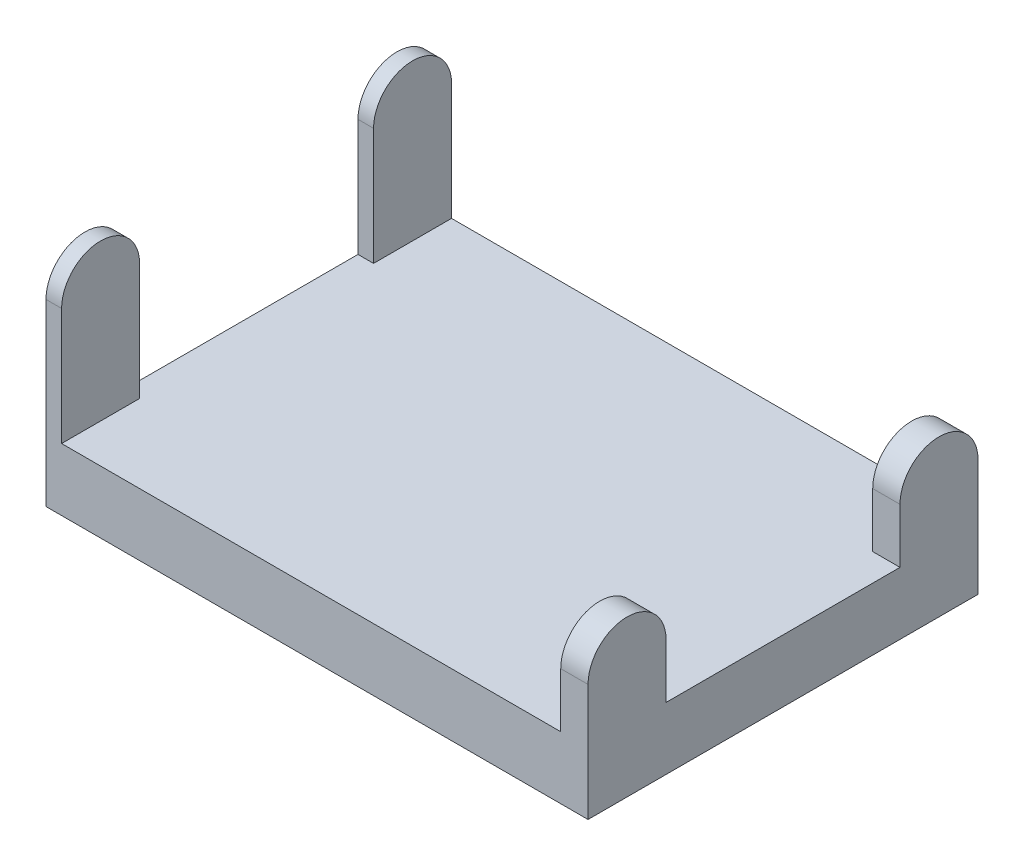
ISO-10303-21;
HEADER;
FILE_DESCRIPTION(('STEP AP214'),'2;1');
FILE_NAME('part.step','',(''),(''),'','','');
FILE_SCHEMA(('AUTOMOTIVE_DESIGN { 1 0 10303 214 1 1 1 1 }'));
ENDSEC;
DATA;
#1=APPLICATION_CONTEXT('core data for automotive mechanical design processes');
#2=APPLICATION_PROTOCOL_DEFINITION('international standard','automotive_design',2000,#1);
#3=PRODUCT_CONTEXT('',#1,'mechanical');
#4=PRODUCT('Part','Part','',(#3));
#5=PRODUCT_RELATED_PRODUCT_CATEGORY('part','',(#4));
#6=PRODUCT_DEFINITION_FORMATION('','',#4);
#7=PRODUCT_DEFINITION_CONTEXT('part definition',#1,'design');
#8=PRODUCT_DEFINITION('design','',#6,#7);
#9=PRODUCT_DEFINITION_SHAPE('','',#8);
#10=(LENGTH_UNIT() NAMED_UNIT(*) SI_UNIT(.MILLI.,.METRE.));
#11=(NAMED_UNIT(*) PLANE_ANGLE_UNIT() SI_UNIT($,.RADIAN.));
#12=(NAMED_UNIT(*) SI_UNIT($,.STERADIAN.) SOLID_ANGLE_UNIT());
#13=UNCERTAINTY_MEASURE_WITH_UNIT(LENGTH_MEASURE(1.E-05),#10,'distance_accuracy_value','');
#14=(GEOMETRIC_REPRESENTATION_CONTEXT(3) GLOBAL_UNCERTAINTY_ASSIGNED_CONTEXT((#13)) GLOBAL_UNIT_ASSIGNED_CONTEXT((#10,
#11,#12)) REPRESENTATION_CONTEXT('',''));
#15=CARTESIAN_POINT('',(0.,0.,0.));
#16=DIRECTION('',(0.,0.,1.));
#17=DIRECTION('',(1.,0.,0.));
#18=AXIS2_PLACEMENT_3D('',#15,#16,#17);
#19=CARTESIAN_POINT('',(17.375,7.5,10.));
#20=DIRECTION('',(1.,0.,0.));
#21=DIRECTION('',(0.,0.,-1.));
#22=AXIS2_PLACEMENT_3D('',#19,#20,#21);
#23=CYLINDRICAL_SURFACE('',#22,2.5);
#24=DIRECTION('',(-1.,0.,0.));
#25=VECTOR('',#24,1.);
#26=CARTESIAN_POINT('',(17.375,7.5,12.5));
#27=LINE('',#26,#25);
#28=CARTESIAN_POINT('',(17.375,7.5,12.5));
#29=VERTEX_POINT('',#28);
#30=CARTESIAN_POINT('',(15.625,7.5,12.5));
#31=VERTEX_POINT('',#30);
#32=EDGE_CURVE('E274',#29,#31,#27,.T.);
#33=ORIENTED_EDGE('',*,*,#32,.F.);
#34=CARTESIAN_POINT('',(17.375,7.5,10.));
#35=DIRECTION('',(-1.,0.,0.));
#36=DIRECTION('',(0.,0.,1.));
#37=AXIS2_PLACEMENT_3D('',#34,#35,#36);
#38=CIRCLE('',#37,2.5);
#39=CARTESIAN_POINT('',(17.375,7.5,7.5));
#40=VERTEX_POINT('',#39);
#41=EDGE_CURVE('E49',#40,#29,#38,.F.);
#42=ORIENTED_EDGE('',*,*,#41,.F.);
#43=DIRECTION('',(-1.,0.,0.));
#44=VECTOR('',#43,1.);
#45=CARTESIAN_POINT('',(17.375,7.5,7.5));
#46=LINE('',#45,#44);
#47=CARTESIAN_POINT('',(15.625,7.5,7.5));
#48=VERTEX_POINT('',#47);
#49=EDGE_CURVE('E276',#48,#40,#46,.F.);
#50=ORIENTED_EDGE('',*,*,#49,.F.);
#51=CARTESIAN_POINT('',(15.625,7.5,10.));
#52=DIRECTION('',(1.,0.,0.));
#53=DIRECTION('',(0.,0.,-1.));
#54=AXIS2_PLACEMENT_3D('',#51,#52,#53);
#55=CIRCLE('',#54,2.5);
#56=EDGE_CURVE('E11',#31,#48,#55,.F.);
#57=ORIENTED_EDGE('',*,*,#56,.F.);
#58=EDGE_LOOP('',(#33,#42,#50,#57));
#59=FACE_BOUND('',#58,.T.);
#60=ADVANCED_FACE('F41',(#59),#23,.T.);
#61=CARTESIAN_POINT('',(17.375,7.5,-10.));
#62=DIRECTION('',(1.,0.,0.));
#63=DIRECTION('',(0.,0.,-1.));
#64=AXIS2_PLACEMENT_3D('',#61,#62,#63);
#65=CYLINDRICAL_SURFACE('',#64,2.5);
#66=DIRECTION('',(-1.,0.,0.));
#67=VECTOR('',#66,1.);
#68=CARTESIAN_POINT('',(17.375,7.5,-7.5));
#69=LINE('',#68,#67);
#70=CARTESIAN_POINT('',(17.375,7.5,-7.5));
#71=VERTEX_POINT('',#70);
#72=CARTESIAN_POINT('',(15.625,7.5,-7.5));
#73=VERTEX_POINT('',#72);
#74=EDGE_CURVE('E264',#71,#73,#69,.T.);
#75=ORIENTED_EDGE('',*,*,#74,.F.);
#76=CARTESIAN_POINT('',(17.375,7.5,-10.));
#77=DIRECTION('',(-1.,0.,0.));
#78=DIRECTION('',(0.,0.,1.));
#79=AXIS2_PLACEMENT_3D('',#76,#77,#78);
#80=CIRCLE('',#79,2.5);
#81=CARTESIAN_POINT('',(17.375,7.5,-12.5));
#82=VERTEX_POINT('',#81);
#83=EDGE_CURVE('E270',#82,#71,#80,.F.);
#84=ORIENTED_EDGE('',*,*,#83,.F.);
#85=DIRECTION('',(-1.,0.,0.));
#86=VECTOR('',#85,1.);
#87=CARTESIAN_POINT('',(17.375,7.5,-12.5));
#88=LINE('',#87,#86);
#89=CARTESIAN_POINT('',(15.625,7.5,-12.5));
#90=VERTEX_POINT('',#89);
#91=EDGE_CURVE('E267',#90,#82,#88,.F.);
#92=ORIENTED_EDGE('',*,*,#91,.F.);
#93=CARTESIAN_POINT('',(15.625,7.5,-10.));
#94=DIRECTION('',(1.,0.,0.));
#95=DIRECTION('',(0.,0.,-1.));
#96=AXIS2_PLACEMENT_3D('',#93,#94,#95);
#97=CIRCLE('',#96,2.5);
#98=EDGE_CURVE('E272',#73,#90,#97,.F.);
#99=ORIENTED_EDGE('',*,*,#98,.F.);
#100=EDGE_LOOP('',(#75,#84,#92,#99));
#101=FACE_BOUND('',#100,.T.);
#102=ADVANCED_FACE('F297',(#101),#65,.T.);
#103=CARTESIAN_POINT('',(-17.375,11.5,10.));
#104=DIRECTION('',(-1.,0.,0.));
#105=DIRECTION('',(0.,0.,1.));
#106=AXIS2_PLACEMENT_3D('',#103,#104,#105);
#107=CYLINDRICAL_SURFACE('',#106,2.5);
#108=DIRECTION('',(-1.,0.,0.));
#109=VECTOR('',#108,1.);
#110=CARTESIAN_POINT('',(-17.375,11.5,7.5));
#111=LINE('',#110,#109);
#112=CARTESIAN_POINT('',(-17.375,11.5,7.5));
#113=VERTEX_POINT('',#112);
#114=CARTESIAN_POINT('',(-16.375,11.5,7.5));
#115=VERTEX_POINT('',#114);
#116=EDGE_CURVE('E256',#113,#115,#111,.F.);
#117=ORIENTED_EDGE('',*,*,#116,.F.);
#118=CARTESIAN_POINT('',(-17.375,11.5,10.));
#119=DIRECTION('',(1.,0.,0.));
#120=DIRECTION('',(0.,0.,-1.));
#121=AXIS2_PLACEMENT_3D('',#118,#119,#120);
#122=CIRCLE('',#121,2.5);
#123=CARTESIAN_POINT('',(-17.375,11.5,12.5));
#124=VERTEX_POINT('',#123);
#125=EDGE_CURVE('E261',#124,#113,#122,.F.);
#126=ORIENTED_EDGE('',*,*,#125,.F.);
#127=DIRECTION('',(-1.,0.,0.));
#128=VECTOR('',#127,1.);
#129=CARTESIAN_POINT('',(-17.375,11.5,12.5));
#130=LINE('',#129,#128);
#131=CARTESIAN_POINT('',(-16.375,11.5,12.5));
#132=VERTEX_POINT('',#131);
#133=EDGE_CURVE('E259',#132,#124,#130,.T.);
#134=ORIENTED_EDGE('',*,*,#133,.F.);
#135=CARTESIAN_POINT('',(-16.375,11.5,10.));
#136=DIRECTION('',(-1.,0.,0.));
#137=DIRECTION('',(0.,0.,1.));
#138=AXIS2_PLACEMENT_3D('',#135,#136,#137);
#139=CIRCLE('',#138,2.5);
#140=EDGE_CURVE('E157',#115,#132,#139,.F.);
#141=ORIENTED_EDGE('',*,*,#140,.F.);
#142=EDGE_LOOP('',(#117,#126,#134,#141));
#143=FACE_BOUND('',#142,.T.);
#144=ADVANCED_FACE('F322',(#143),#107,.T.);
#145=CARTESIAN_POINT('',(-17.375,11.5,-10.));
#146=DIRECTION('',(-1.,0.,0.));
#147=DIRECTION('',(0.,0.,1.));
#148=AXIS2_PLACEMENT_3D('',#145,#146,#147);
#149=CYLINDRICAL_SURFACE('',#148,2.5);
#150=DIRECTION('',(1.,0.,0.));
#151=VECTOR('',#150,1.);
#152=CARTESIAN_POINT('',(-17.375,11.5,-12.5));
#153=LINE('',#152,#151);
#154=CARTESIAN_POINT('',(-17.375,11.5,-12.5));
#155=VERTEX_POINT('',#154);
#156=CARTESIAN_POINT('',(-16.375,11.5,-12.5));
#157=VERTEX_POINT('',#156);
#158=EDGE_CURVE('E246',#155,#157,#153,.T.);
#159=ORIENTED_EDGE('',*,*,#158,.F.);
#160=CARTESIAN_POINT('',(-17.375,11.5,-10.));
#161=DIRECTION('',(1.,0.,0.));
#162=DIRECTION('',(0.,0.,-1.));
#163=AXIS2_PLACEMENT_3D('',#160,#161,#162);
#164=CIRCLE('',#163,2.5);
#165=CARTESIAN_POINT('',(-17.375,11.5,-7.5));
#166=VERTEX_POINT('',#165);
#167=EDGE_CURVE('E252',#166,#155,#164,.F.);
#168=ORIENTED_EDGE('',*,*,#167,.F.);
#169=DIRECTION('',(1.,0.,0.));
#170=VECTOR('',#169,1.);
#171=CARTESIAN_POINT('',(-17.375,11.5,-7.5));
#172=LINE('',#171,#170);
#173=CARTESIAN_POINT('',(-16.375,11.5,-7.5));
#174=VERTEX_POINT('',#173);
#175=EDGE_CURVE('E249',#174,#166,#172,.F.);
#176=ORIENTED_EDGE('',*,*,#175,.F.);
#177=CARTESIAN_POINT('',(-16.375,11.5,-10.));
#178=DIRECTION('',(-1.,0.,0.));
#179=DIRECTION('',(0.,0.,1.));
#180=AXIS2_PLACEMENT_3D('',#177,#178,#179);
#181=CIRCLE('',#180,2.5);
#182=EDGE_CURVE('E254',#157,#174,#181,.F.);
#183=ORIENTED_EDGE('',*,*,#182,.F.);
#184=EDGE_LOOP('',(#159,#168,#176,#183));
#185=FACE_BOUND('',#184,.T.);
#186=ADVANCED_FACE('F326',(#185),#149,.T.);
#187=CARTESIAN_POINT('',(0.,4.,0.));
#188=DIRECTION('',(0.,1.,0.));
#189=DIRECTION('',(0.,0.,1.));
#190=AXIS2_PLACEMENT_3D('',#187,#188,#189);
#191=PLANE('',#190);
#192=DIRECTION('',(-1.,0.,0.));
#193=VECTOR('',#192,1.);
#194=CARTESIAN_POINT('',(-17.375,4.,7.5));
#195=LINE('',#194,#193);
#196=CARTESIAN_POINT('',(-16.375,4.,7.5));
#197=VERTEX_POINT('',#196);
#198=CARTESIAN_POINT('',(-17.375,4.,7.5));
#199=VERTEX_POINT('',#198);
#200=EDGE_CURVE('E180',#197,#199,#195,.T.);
#201=ORIENTED_EDGE('',*,*,#200,.F.);
#202=DIRECTION('',(0.,0.,-1.));
#203=VECTOR('',#202,1.);
#204=CARTESIAN_POINT('',(-16.375,4.,12.5));
#205=LINE('',#204,#203);
#206=CARTESIAN_POINT('',(-16.375,4.,12.5));
#207=VERTEX_POINT('',#206);
#208=EDGE_CURVE('E156',#207,#197,#205,.T.);
#209=ORIENTED_EDGE('',*,*,#208,.F.);
#210=DIRECTION('',(1.,0.,0.));
#211=VECTOR('',#210,1.);
#212=CARTESIAN_POINT('',(-17.375,4.,12.5));
#213=LINE('',#212,#211);
#214=CARTESIAN_POINT('',(15.625,4.,12.5));
#215=VERTEX_POINT('',#214);
#216=EDGE_CURVE('E165',#207,#215,#213,.T.);
#217=ORIENTED_EDGE('',*,*,#216,.T.);
#218=DIRECTION('',(0.,0.,1.));
#219=VECTOR('',#218,1.);
#220=CARTESIAN_POINT('',(15.625,4.,7.5));
#221=LINE('',#220,#219);
#222=CARTESIAN_POINT('',(15.625,4.,7.5));
#223=VERTEX_POINT('',#222);
#224=EDGE_CURVE('E210',#223,#215,#221,.T.);
#225=ORIENTED_EDGE('',*,*,#224,.F.);
#226=DIRECTION('',(-1.,0.,0.));
#227=VECTOR('',#226,1.);
#228=CARTESIAN_POINT('',(15.625,4.,7.5));
#229=LINE('',#228,#227);
#230=CARTESIAN_POINT('',(17.375,4.,7.5));
#231=VERTEX_POINT('',#230);
#232=EDGE_CURVE('E212',#231,#223,#229,.T.);
#233=ORIENTED_EDGE('',*,*,#232,.F.);
#234=DIRECTION('',(0.,0.,-1.));
#235=VECTOR('',#234,1.);
#236=CARTESIAN_POINT('',(17.375,4.,-12.5));
#237=LINE('',#236,#235);
#238=CARTESIAN_POINT('',(17.375,4.,-7.5));
#239=VERTEX_POINT('',#238);
#240=EDGE_CURVE('E221',#231,#239,#237,.T.);
#241=ORIENTED_EDGE('',*,*,#240,.T.);
#242=DIRECTION('',(1.,0.,0.));
#243=VECTOR('',#242,1.);
#244=CARTESIAN_POINT('',(15.625,4.,-7.5));
#245=LINE('',#244,#243);
#246=CARTESIAN_POINT('',(15.625,4.,-7.5));
#247=VERTEX_POINT('',#246);
#248=EDGE_CURVE('E198',#247,#239,#245,.T.);
#249=ORIENTED_EDGE('',*,*,#248,.F.);
#250=DIRECTION('',(0.,0.,1.));
#251=VECTOR('',#250,1.);
#252=CARTESIAN_POINT('',(15.625,4.,-7.5));
#253=LINE('',#252,#251);
#254=CARTESIAN_POINT('',(15.625,4.,-12.5));
#255=VERTEX_POINT('',#254);
#256=EDGE_CURVE('E201',#255,#247,#253,.T.);
#257=ORIENTED_EDGE('',*,*,#256,.F.);
#258=DIRECTION('',(-1.,0.,0.));
#259=VECTOR('',#258,1.);
#260=CARTESIAN_POINT('',(-17.375,4.,-12.5));
#261=LINE('',#260,#259);
#262=CARTESIAN_POINT('',(-16.375,4.,-12.5));
#263=VERTEX_POINT('',#262);
#264=EDGE_CURVE('E224',#255,#263,#261,.T.);
#265=ORIENTED_EDGE('',*,*,#264,.T.);
#266=DIRECTION('',(0.,0.,-1.));
#267=VECTOR('',#266,1.);
#268=CARTESIAN_POINT('',(-16.375,4.,-12.5));
#269=LINE('',#268,#267);
#270=CARTESIAN_POINT('',(-16.375,4.,-7.5));
#271=VERTEX_POINT('',#270);
#272=EDGE_CURVE('E189',#271,#263,#269,.T.);
#273=ORIENTED_EDGE('',*,*,#272,.F.);
#274=DIRECTION('',(1.,0.,0.));
#275=VECTOR('',#274,1.);
#276=CARTESIAN_POINT('',(-17.375,4.,-7.5));
#277=LINE('',#276,#275);
#278=CARTESIAN_POINT('',(-17.375,4.,-7.5));
#279=VERTEX_POINT('',#278);
#280=EDGE_CURVE('E161',#279,#271,#277,.T.);
#281=ORIENTED_EDGE('',*,*,#280,.F.);
#282=DIRECTION('',(0.,0.,1.));
#283=VECTOR('',#282,1.);
#284=CARTESIAN_POINT('',(-17.375,4.,-12.5));
#285=LINE('',#284,#283);
#286=EDGE_CURVE('E174',#279,#199,#285,.T.);
#287=ORIENTED_EDGE('',*,*,#286,.T.);
#288=EDGE_LOOP('',(#201,#209,#217,#225,#233,#241,#249,#257,#265,#273,#281,#287));
#289=FACE_BOUND('',#288,.T.);
#290=ADVANCED_FACE('F177',(#289),#191,.T.);
#291=CARTESIAN_POINT('',(17.375,4.,-12.5));
#292=DIRECTION('',(-1.,0.,0.));
#293=DIRECTION('',(0.,0.,1.));
#294=AXIS2_PLACEMENT_3D('',#291,#292,#293);
#295=PLANE('',#294);
#296=DIRECTION('',(0.,-1.,0.));
#297=VECTOR('',#296,1.);
#298=CARTESIAN_POINT('',(17.375,10.,7.5));
#299=LINE('',#298,#297);
#300=EDGE_CURVE('E217',#40,#231,#299,.T.);
#301=ORIENTED_EDGE('',*,*,#300,.F.);
#302=ORIENTED_EDGE('',*,*,#41,.T.);
#303=DIRECTION('',(0.,-1.,0.));
#304=VECTOR('',#303,1.);
#305=CARTESIAN_POINT('',(17.375,4.,12.5));
#306=LINE('',#305,#304);
#307=CARTESIAN_POINT('',(17.375,0.,12.5));
#308=VERTEX_POINT('',#307);
#309=EDGE_CURVE('E173',#29,#308,#306,.T.);
#310=ORIENTED_EDGE('',*,*,#309,.T.);
#311=DIRECTION('',(0.,0.,-1.));
#312=VECTOR('',#311,1.);
#313=CARTESIAN_POINT('',(17.375,0.,-12.5));
#314=LINE('',#313,#312);
#315=CARTESIAN_POINT('',(17.375,0.,-12.5));
#316=VERTEX_POINT('',#315);
#317=EDGE_CURVE('E220',#308,#316,#314,.T.);
#318=ORIENTED_EDGE('',*,*,#317,.T.);
#319=DIRECTION('',(0.,-1.,0.));
#320=VECTOR('',#319,1.);
#321=CARTESIAN_POINT('',(17.375,4.,-12.5));
#322=LINE('',#321,#320);
#323=EDGE_CURVE('E244',#82,#316,#322,.T.);
#324=ORIENTED_EDGE('',*,*,#323,.F.);
#325=ORIENTED_EDGE('',*,*,#83,.T.);
#326=DIRECTION('',(0.,-1.,0.));
#327=VECTOR('',#326,1.);
#328=CARTESIAN_POINT('',(17.375,10.,-7.5));
#329=LINE('',#328,#327);
#330=EDGE_CURVE('E208',#71,#239,#329,.T.);
#331=ORIENTED_EDGE('',*,*,#330,.T.);
#332=ORIENTED_EDGE('',*,*,#240,.F.);
#333=EDGE_LOOP('',(#301,#302,#310,#318,#324,#325,#331,#332));
#334=FACE_BOUND('',#333,.T.);
#335=ADVANCED_FACE('F279',(#334),#295,.F.);
#336=CARTESIAN_POINT('',(-17.375,4.,-12.5));
#337=DIRECTION('',(0.,0.,1.));
#338=DIRECTION('',(1.,0.,0.));
#339=AXIS2_PLACEMENT_3D('',#336,#337,#338);
#340=PLANE('',#339);
#341=DIRECTION('',(0.,-1.,0.));
#342=VECTOR('',#341,1.);
#343=CARTESIAN_POINT('',(15.625,10.,-12.5));
#344=LINE('',#343,#342);
#345=EDGE_CURVE('E206',#90,#255,#344,.T.);
#346=ORIENTED_EDGE('',*,*,#345,.F.);
#347=ORIENTED_EDGE('',*,*,#91,.T.);
#348=ORIENTED_EDGE('',*,*,#323,.T.);
#349=DIRECTION('',(-1.,0.,0.));
#350=VECTOR('',#349,1.);
#351=CARTESIAN_POINT('',(-17.375,0.,-12.5));
#352=LINE('',#351,#350);
#353=CARTESIAN_POINT('',(-17.375,0.,-12.5));
#354=VERTEX_POINT('',#353);
#355=EDGE_CURVE('E231',#316,#354,#352,.T.);
#356=ORIENTED_EDGE('',*,*,#355,.T.);
#357=DIRECTION('',(0.,-1.,0.));
#358=VECTOR('',#357,1.);
#359=CARTESIAN_POINT('',(-17.375,4.,-12.5));
#360=LINE('',#359,#358);
#361=EDGE_CURVE('E242',#155,#354,#360,.T.);
#362=ORIENTED_EDGE('',*,*,#361,.F.);
#363=ORIENTED_EDGE('',*,*,#158,.T.);
#364=DIRECTION('',(0.,-1.,0.));
#365=VECTOR('',#364,1.);
#366=CARTESIAN_POINT('',(-16.375,14.,-12.5));
#367=LINE('',#366,#365);
#368=EDGE_CURVE('E192',#157,#263,#367,.T.);
#369=ORIENTED_EDGE('',*,*,#368,.T.);
#370=ORIENTED_EDGE('',*,*,#264,.F.);
#371=EDGE_LOOP('',(#346,#347,#348,#356,#362,#363,#369,#370));
#372=FACE_BOUND('',#371,.T.);
#373=ADVANCED_FACE('F292',(#372),#340,.F.);
#374=CARTESIAN_POINT('',(-17.375,4.,-12.5));
#375=DIRECTION('',(1.,0.,0.));
#376=DIRECTION('',(0.,0.,-1.));
#377=AXIS2_PLACEMENT_3D('',#374,#375,#376);
#378=PLANE('',#377);
#379=DIRECTION('',(0.,-1.,0.));
#380=VECTOR('',#379,1.);
#381=CARTESIAN_POINT('',(-17.375,4.,12.5));
#382=LINE('',#381,#380);
#383=CARTESIAN_POINT('',(-17.375,0.,12.5));
#384=VERTEX_POINT('',#383);
#385=EDGE_CURVE('E240',#124,#384,#382,.T.);
#386=ORIENTED_EDGE('',*,*,#385,.F.);
#387=ORIENTED_EDGE('',*,*,#125,.T.);
#388=DIRECTION('',(0.,-1.,0.));
#389=VECTOR('',#388,1.);
#390=CARTESIAN_POINT('',(-17.375,14.,7.5));
#391=LINE('',#390,#389);
#392=EDGE_CURVE('E182',#113,#199,#391,.T.);
#393=ORIENTED_EDGE('',*,*,#392,.T.);
#394=ORIENTED_EDGE('',*,*,#286,.F.);
#395=DIRECTION('',(0.,-1.,0.));
#396=VECTOR('',#395,1.);
#397=CARTESIAN_POINT('',(-17.375,14.,-7.5));
#398=LINE('',#397,#396);
#399=EDGE_CURVE('E196',#166,#279,#398,.T.);
#400=ORIENTED_EDGE('',*,*,#399,.F.);
#401=ORIENTED_EDGE('',*,*,#167,.T.);
#402=ORIENTED_EDGE('',*,*,#361,.T.);
#403=DIRECTION('',(0.,0.,1.));
#404=VECTOR('',#403,1.);
#405=CARTESIAN_POINT('',(-17.375,0.,-12.5));
#406=LINE('',#405,#404);
#407=EDGE_CURVE('E234',#354,#384,#406,.T.);
#408=ORIENTED_EDGE('',*,*,#407,.T.);
#409=EDGE_LOOP('',(#386,#387,#393,#394,#400,#401,#402,#408));
#410=FACE_BOUND('',#409,.T.);
#411=ADVANCED_FACE('F346',(#410),#378,.F.);
#412=CARTESIAN_POINT('',(-17.375,4.,12.5));
#413=DIRECTION('',(0.,0.,-1.));
#414=DIRECTION('',(-1.,0.,0.));
#415=AXIS2_PLACEMENT_3D('',#412,#413,#414);
#416=PLANE('',#415);
#417=ORIENTED_EDGE('',*,*,#309,.F.);
#418=ORIENTED_EDGE('',*,*,#32,.T.);
#419=DIRECTION('',(0.,-1.,0.));
#420=VECTOR('',#419,1.);
#421=CARTESIAN_POINT('',(15.625,10.,12.5));
#422=LINE('',#421,#420);
#423=EDGE_CURVE('E169',#31,#215,#422,.T.);
#424=ORIENTED_EDGE('',*,*,#423,.T.);
#425=ORIENTED_EDGE('',*,*,#216,.F.);
#426=DIRECTION('',(0.,-1.,0.));
#427=VECTOR('',#426,1.);
#428=CARTESIAN_POINT('',(-16.375,14.,12.5));
#429=LINE('',#428,#427);
#430=EDGE_CURVE('E151',#132,#207,#429,.T.);
#431=ORIENTED_EDGE('',*,*,#430,.F.);
#432=ORIENTED_EDGE('',*,*,#133,.T.);
#433=ORIENTED_EDGE('',*,*,#385,.T.);
#434=DIRECTION('',(1.,0.,0.));
#435=VECTOR('',#434,1.);
#436=CARTESIAN_POINT('',(-17.375,0.,12.5));
#437=LINE('',#436,#435);
#438=EDGE_CURVE('E225',#384,#308,#437,.T.);
#439=ORIENTED_EDGE('',*,*,#438,.T.);
#440=EDGE_LOOP('',(#417,#418,#424,#425,#431,#432,#433,#439));
#441=FACE_BOUND('',#440,.T.);
#442=ADVANCED_FACE('F167',(#441),#416,.F.);
#443=CARTESIAN_POINT('',(0.,0.,0.));
#444=DIRECTION('',(0.,1.,0.));
#445=DIRECTION('',(0.,0.,1.));
#446=AXIS2_PLACEMENT_3D('',#443,#444,#445);
#447=PLANE('',#446);
#448=ORIENTED_EDGE('',*,*,#317,.F.);
#449=ORIENTED_EDGE('',*,*,#438,.F.);
#450=ORIENTED_EDGE('',*,*,#407,.F.);
#451=ORIENTED_EDGE('',*,*,#355,.F.);
#452=EDGE_LOOP('',(#448,#449,#450,#451));
#453=FACE_BOUND('',#452,.T.);
#454=ADVANCED_FACE('F287',(#453),#447,.F.);
#455=CARTESIAN_POINT('',(15.625,10.,7.5));
#456=DIRECTION('',(1.,0.,0.));
#457=DIRECTION('',(0.,0.,-1.));
#458=AXIS2_PLACEMENT_3D('',#455,#456,#457);
#459=PLANE('',#458);
#460=ORIENTED_EDGE('',*,*,#423,.F.);
#461=ORIENTED_EDGE('',*,*,#56,.T.);
#462=DIRECTION('',(0.,-1.,0.));
#463=VECTOR('',#462,1.);
#464=CARTESIAN_POINT('',(15.625,10.,7.5));
#465=LINE('',#464,#463);
#466=EDGE_CURVE('E215',#48,#223,#465,.T.);
#467=ORIENTED_EDGE('',*,*,#466,.T.);
#468=ORIENTED_EDGE('',*,*,#224,.T.);
#469=EDGE_LOOP('',(#460,#461,#467,#468));
#470=FACE_BOUND('',#469,.T.);
#471=ADVANCED_FACE('F308',(#470),#459,.F.);
#472=CARTESIAN_POINT('',(15.625,10.,7.5));
#473=DIRECTION('',(0.,0.,1.));
#474=DIRECTION('',(1.,0.,0.));
#475=AXIS2_PLACEMENT_3D('',#472,#473,#474);
#476=PLANE('',#475);
#477=ORIENTED_EDGE('',*,*,#466,.F.);
#478=ORIENTED_EDGE('',*,*,#49,.T.);
#479=ORIENTED_EDGE('',*,*,#300,.T.);
#480=ORIENTED_EDGE('',*,*,#232,.T.);
#481=EDGE_LOOP('',(#477,#478,#479,#480));
#482=FACE_BOUND('',#481,.T.);
#483=ADVANCED_FACE('F307',(#482),#476,.F.);
#484=CARTESIAN_POINT('',(15.625,10.,-7.5));
#485=DIRECTION('',(0.,0.,-1.));
#486=DIRECTION('',(-1.,0.,0.));
#487=AXIS2_PLACEMENT_3D('',#484,#485,#486);
#488=PLANE('',#487);
#489=ORIENTED_EDGE('',*,*,#330,.F.);
#490=ORIENTED_EDGE('',*,*,#74,.T.);
#491=DIRECTION('',(0.,-1.,0.));
#492=VECTOR('',#491,1.);
#493=CARTESIAN_POINT('',(15.625,10.,-7.5));
#494=LINE('',#493,#492);
#495=EDGE_CURVE('E204',#73,#247,#494,.T.);
#496=ORIENTED_EDGE('',*,*,#495,.T.);
#497=ORIENTED_EDGE('',*,*,#248,.T.);
#498=EDGE_LOOP('',(#489,#490,#496,#497));
#499=FACE_BOUND('',#498,.T.);
#500=ADVANCED_FACE('F301',(#499),#488,.F.);
#501=CARTESIAN_POINT('',(15.625,10.,-7.5));
#502=DIRECTION('',(1.,0.,0.));
#503=DIRECTION('',(0.,0.,-1.));
#504=AXIS2_PLACEMENT_3D('',#501,#502,#503);
#505=PLANE('',#504);
#506=ORIENTED_EDGE('',*,*,#495,.F.);
#507=ORIENTED_EDGE('',*,*,#98,.T.);
#508=ORIENTED_EDGE('',*,*,#345,.T.);
#509=ORIENTED_EDGE('',*,*,#256,.T.);
#510=EDGE_LOOP('',(#506,#507,#508,#509));
#511=FACE_BOUND('',#510,.T.);
#512=ADVANCED_FACE('F424',(#511),#505,.F.);
#513=CARTESIAN_POINT('',(-17.375,14.,-7.5));
#514=DIRECTION('',(0.,0.,-1.));
#515=DIRECTION('',(-1.,0.,0.));
#516=AXIS2_PLACEMENT_3D('',#513,#514,#515);
#517=PLANE('',#516);
#518=DIRECTION('',(0.,-1.,0.));
#519=VECTOR('',#518,1.);
#520=CARTESIAN_POINT('',(-16.375,14.,-7.5));
#521=LINE('',#520,#519);
#522=EDGE_CURVE('E194',#174,#271,#521,.T.);
#523=ORIENTED_EDGE('',*,*,#522,.F.);
#524=ORIENTED_EDGE('',*,*,#175,.T.);
#525=ORIENTED_EDGE('',*,*,#399,.T.);
#526=ORIENTED_EDGE('',*,*,#280,.T.);
#527=EDGE_LOOP('',(#523,#524,#525,#526));
#528=FACE_BOUND('',#527,.T.);
#529=ADVANCED_FACE('F431',(#528),#517,.F.);
#530=CARTESIAN_POINT('',(-16.375,14.,-12.5));
#531=DIRECTION('',(-1.,0.,0.));
#532=DIRECTION('',(0.,0.,1.));
#533=AXIS2_PLACEMENT_3D('',#530,#531,#532);
#534=PLANE('',#533);
#535=ORIENTED_EDGE('',*,*,#368,.F.);
#536=ORIENTED_EDGE('',*,*,#182,.T.);
#537=ORIENTED_EDGE('',*,*,#522,.T.);
#538=ORIENTED_EDGE('',*,*,#272,.T.);
#539=EDGE_LOOP('',(#535,#536,#537,#538));
#540=FACE_BOUND('',#539,.T.);
#541=ADVANCED_FACE('F471',(#540),#534,.F.);
#542=CARTESIAN_POINT('',(-16.375,14.,12.5));
#543=DIRECTION('',(-1.,0.,0.));
#544=DIRECTION('',(0.,0.,1.));
#545=AXIS2_PLACEMENT_3D('',#542,#543,#544);
#546=PLANE('',#545);
#547=DIRECTION('',(0.,-1.,0.));
#548=VECTOR('',#547,1.);
#549=CARTESIAN_POINT('',(-16.375,14.,7.5));
#550=LINE('',#549,#548);
#551=EDGE_CURVE('E162',#115,#197,#550,.T.);
#552=ORIENTED_EDGE('',*,*,#551,.F.);
#553=ORIENTED_EDGE('',*,*,#140,.T.);
#554=ORIENTED_EDGE('',*,*,#430,.T.);
#555=ORIENTED_EDGE('',*,*,#208,.T.);
#556=EDGE_LOOP('',(#552,#553,#554,#555));
#557=FACE_BOUND('',#556,.T.);
#558=ADVANCED_FACE('F154',(#557),#546,.F.);
#559=CARTESIAN_POINT('',(-17.375,14.,7.5));
#560=DIRECTION('',(0.,0.,1.));
#561=DIRECTION('',(1.,0.,0.));
#562=AXIS2_PLACEMENT_3D('',#559,#560,#561);
#563=PLANE('',#562);
#564=ORIENTED_EDGE('',*,*,#392,.F.);
#565=ORIENTED_EDGE('',*,*,#116,.T.);
#566=ORIENTED_EDGE('',*,*,#551,.T.);
#567=ORIENTED_EDGE('',*,*,#200,.T.);
#568=EDGE_LOOP('',(#564,#565,#566,#567));
#569=FACE_BOUND('',#568,.T.);
#570=ADVANCED_FACE('F459',(#569),#563,.F.);
#571=CLOSED_SHELL('',(#60,#102,#144,#186,#290,#335,#373,#411,#442,#454,#471,#483,#500,#512,#529,
#541,#558,#570));
#572=MANIFOLD_SOLID_BREP('B2',#571);
#573=ADVANCED_BREP_SHAPE_REPRESENTATION('',(#18,#572),#14);
#574=SHAPE_DEFINITION_REPRESENTATION(#9,#573);
ENDSEC;
END-ISO-10303-21;
